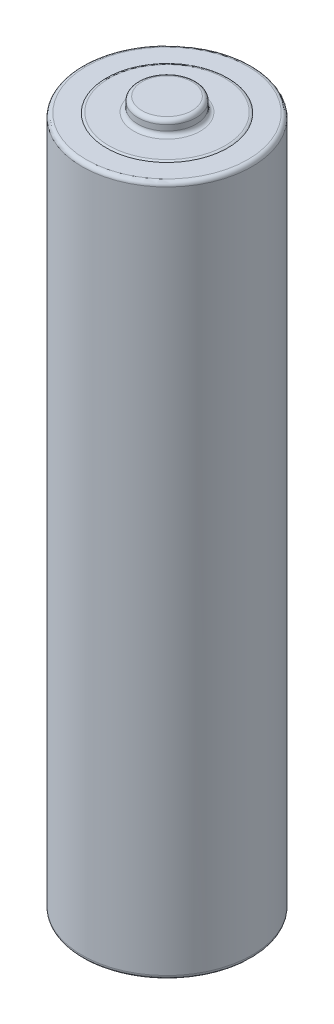
ISO-10303-21;
HEADER;
FILE_DESCRIPTION(('STEP AP214'),'2;1');
FILE_NAME('part.step','',(''),(''),'','','');
FILE_SCHEMA(('AUTOMOTIVE_DESIGN { 1 0 10303 214 1 1 1 1 }'));
ENDSEC;
DATA;
#1=APPLICATION_CONTEXT('core data for automotive mechanical design processes');
#2=APPLICATION_PROTOCOL_DEFINITION('international standard','automotive_design',2000,#1);
#3=PRODUCT_CONTEXT('',#1,'mechanical');
#4=PRODUCT('Part','Part','',(#3));
#5=PRODUCT_RELATED_PRODUCT_CATEGORY('part','',(#4));
#6=PRODUCT_DEFINITION_FORMATION('','',#4);
#7=PRODUCT_DEFINITION_CONTEXT('part definition',#1,'design');
#8=PRODUCT_DEFINITION('design','',#6,#7);
#9=PRODUCT_DEFINITION_SHAPE('','',#8);
#10=(LENGTH_UNIT() NAMED_UNIT(*) SI_UNIT(.MILLI.,.METRE.));
#11=(NAMED_UNIT(*) PLANE_ANGLE_UNIT() SI_UNIT($,.RADIAN.));
#12=(NAMED_UNIT(*) SI_UNIT($,.STERADIAN.) SOLID_ANGLE_UNIT());
#13=UNCERTAINTY_MEASURE_WITH_UNIT(LENGTH_MEASURE(1.E-05),#10,'distance_accuracy_value','');
#14=(GEOMETRIC_REPRESENTATION_CONTEXT(3) GLOBAL_UNCERTAINTY_ASSIGNED_CONTEXT((#13)) GLOBAL_UNIT_ASSIGNED_CONTEXT((#10,
#11,#12)) REPRESENTATION_CONTEXT('',''));
#15=CARTESIAN_POINT('',(0.,0.,0.));
#16=DIRECTION('',(0.,0.,1.));
#17=DIRECTION('',(1.,0.,0.));
#18=AXIS2_PLACEMENT_3D('',#15,#16,#17);
#19=CARTESIAN_POINT('',(1.8,22.2,0.));
#20=DIRECTION('',(0.,1.,0.));
#21=DIRECTION('',(0.,0.,1.));
#22=AXIS2_PLACEMENT_3D('',#19,#20,#21);
#23=PLANE('',#22);
#24=CARTESIAN_POINT('',(0.,22.2,0.));
#25=DIRECTION('',(0.,1.,0.));
#26=DIRECTION('',(0.,0.,1.));
#27=AXIS2_PLACEMENT_3D('',#24,#25,#26);
#28=CIRCLE('',#27,1.546);
#29=CARTESIAN_POINT('',(0.,22.2,1.546));
#30=VERTEX_POINT('',#29);
#31=EDGE_CURVE('E10',#30,#30,#28,.T.);
#32=ORIENTED_EDGE('',*,*,#31,.T.);
#33=EDGE_LOOP('',(#32));
#34=FACE_BOUND('',#33,.T.);
#35=ADVANCED_FACE('F33',(#34),#23,.T.);
#36=CARTESIAN_POINT('',(0.,-22.2,0.));
#37=DIRECTION('',(0.,-1.,0.));
#38=DIRECTION('',(0.,0.,-1.));
#39=AXIS2_PLACEMENT_3D('',#36,#37,#38);
#40=PLANE('',#39);
#41=CARTESIAN_POINT('',(0.,-22.2,0.));
#42=DIRECTION('',(0.,-1.,0.));
#43=DIRECTION('',(0.,0.,-1.));
#44=AXIS2_PLACEMENT_3D('',#41,#42,#43);
#45=CIRCLE('',#44,3.04600000000001);
#46=CARTESIAN_POINT('',(0.,-22.2,-3.04600000000001));
#47=VERTEX_POINT('',#46);
#48=EDGE_CURVE('E65',#47,#47,#45,.T.);
#49=ORIENTED_EDGE('',*,*,#48,.T.);
#50=EDGE_LOOP('',(#49));
#51=FACE_BOUND('',#50,.T.);
#52=ADVANCED_FACE('F102',(#51),#40,.T.);
#53=CARTESIAN_POINT('',(0.,-28.2802360600965,0.));
#54=DIRECTION('',(0.,-1.,0.));
#55=DIRECTION('',(0.,0.,-1.));
#56=AXIS2_PLACEMENT_3D('',#53,#54,#55);
#57=CYLINDRICAL_SURFACE('',#56,3.30000000000001);
#58=CARTESIAN_POINT('',(0.,-21.946,0.));
#59=DIRECTION('',(0.,-1.,0.));
#60=DIRECTION('',(0.,0.,-1.));
#61=AXIS2_PLACEMENT_3D('',#58,#59,#60);
#62=CIRCLE('',#61,3.30000000000001);
#63=CARTESIAN_POINT('',(0.,-21.946,-3.30000000000001));
#64=VERTEX_POINT('',#63);
#65=EDGE_CURVE('E59',#64,#64,#62,.F.);
#66=ORIENTED_EDGE('',*,*,#65,.T.);
#67=EDGE_LOOP('',(#66));
#68=FACE_BOUND('',#67,.T.);
#69=CARTESIAN_POINT('',(0.,-21.692,0.));
#70=DIRECTION('',(0.,-1.,0.));
#71=DIRECTION('',(0.,0.,-1.));
#72=AXIS2_PLACEMENT_3D('',#69,#70,#71);
#73=CIRCLE('',#72,3.30000000000001);
#74=CARTESIAN_POINT('',(0.,-21.692,-3.30000000000001));
#75=VERTEX_POINT('',#74);
#76=EDGE_CURVE('E62',#75,#75,#73,.T.);
#77=ORIENTED_EDGE('',*,*,#76,.T.);
#78=EDGE_LOOP('',(#77));
#79=FACE_BOUND('',#78,.T.);
#80=ADVANCED_FACE('F107',(#68,#79),#57,.T.);
#81=CARTESIAN_POINT('',(3.3,-21.438,0.));
#82=DIRECTION('',(0.,-1.,0.));
#83=DIRECTION('',(0.,0.,-1.));
#84=AXIS2_PLACEMENT_3D('',#81,#82,#83);
#85=PLANE('',#84);
#86=CARTESIAN_POINT('',(0.,-21.438,0.));
#87=DIRECTION('',(0.,-1.,0.));
#88=DIRECTION('',(0.,0.,-1.));
#89=AXIS2_PLACEMENT_3D('',#86,#87,#88);
#90=CIRCLE('',#89,3.55400000000001);
#91=CARTESIAN_POINT('',(0.,-21.438,-3.55400000000001));
#92=VERTEX_POINT('',#91);
#93=EDGE_CURVE('E56',#92,#92,#90,.F.);
#94=ORIENTED_EDGE('',*,*,#93,.T.);
#95=EDGE_LOOP('',(#94));
#96=FACE_BOUND('',#95,.T.);
#97=CARTESIAN_POINT('',(0.,-21.438,0.));
#98=DIRECTION('',(0.,-1.,0.));
#99=DIRECTION('',(0.,0.,-1.));
#100=AXIS2_PLACEMENT_3D('',#97,#98,#99);
#101=CIRCLE('',#100,4.99600000000001);
#102=CARTESIAN_POINT('',(0.,-21.438,-4.99600000000001));
#103=VERTEX_POINT('',#102);
#104=EDGE_CURVE('E68',#103,#103,#101,.T.);
#105=ORIENTED_EDGE('',*,*,#104,.T.);
#106=EDGE_LOOP('',(#105));
#107=FACE_BOUND('',#106,.T.);
#108=ADVANCED_FACE('F131',(#96,#107),#85,.T.);
#109=CARTESIAN_POINT('',(0.,-28.2802360600965,0.));
#110=DIRECTION('',(0.,-1.,0.));
#111=DIRECTION('',(0.,0.,-1.));
#112=AXIS2_PLACEMENT_3D('',#109,#110,#111);
#113=CYLINDRICAL_SURFACE('',#112,5.25000000000001);
#114=CARTESIAN_POINT('',(0.,21.046,0.));
#115=DIRECTION('',(0.,1.,0.));
#116=DIRECTION('',(0.,0.,1.));
#117=AXIS2_PLACEMENT_3D('',#114,#115,#116);
#118=CIRCLE('',#117,5.25000000000001);
#119=CARTESIAN_POINT('',(0.,21.046,5.25000000000001));
#120=VERTEX_POINT('',#119);
#121=EDGE_CURVE('E74',#120,#120,#118,.F.);
#122=ORIENTED_EDGE('',*,*,#121,.T.);
#123=EDGE_LOOP('',(#122));
#124=FACE_BOUND('',#123,.T.);
#125=CARTESIAN_POINT('',(0.,-21.184,0.));
#126=DIRECTION('',(0.,-1.,0.));
#127=DIRECTION('',(0.,0.,-1.));
#128=AXIS2_PLACEMENT_3D('',#125,#126,#127);
#129=CIRCLE('',#128,5.25000000000001);
#130=CARTESIAN_POINT('',(0.,-21.184,-5.25000000000001));
#131=VERTEX_POINT('',#130);
#132=EDGE_CURVE('E77',#131,#131,#129,.F.);
#133=ORIENTED_EDGE('',*,*,#132,.T.);
#134=EDGE_LOOP('',(#133));
#135=FACE_BOUND('',#134,.T.);
#136=ADVANCED_FACE('F137',(#124,#135),#113,.T.);
#137=CARTESIAN_POINT('',(5.25000000000001,21.3,0.));
#138=DIRECTION('',(0.,1.,0.));
#139=DIRECTION('',(0.,0.,1.));
#140=AXIS2_PLACEMENT_3D('',#137,#138,#139);
#141=PLANE('',#140);
#142=CARTESIAN_POINT('',(0.,21.3,0.));
#143=DIRECTION('',(0.,1.,0.));
#144=DIRECTION('',(0.,0.,1.));
#145=AXIS2_PLACEMENT_3D('',#142,#143,#144);
#146=CIRCLE('',#145,4.99600000000001);
#147=CARTESIAN_POINT('',(0.,21.3,4.99600000000001));
#148=VERTEX_POINT('',#147);
#149=EDGE_CURVE('E71',#148,#148,#146,.T.);
#150=ORIENTED_EDGE('',*,*,#149,.T.);
#151=EDGE_LOOP('',(#150));
#152=FACE_BOUND('',#151,.T.);
#153=CARTESIAN_POINT('',(0.,21.3,0.));
#154=DIRECTION('',(0.,-1.,0.));
#155=DIRECTION('',(0.,0.,-1.));
#156=AXIS2_PLACEMENT_3D('',#153,#154,#155);
#157=CIRCLE('',#156,3.75000000000001);
#158=CARTESIAN_POINT('',(0.,21.3,-3.75000000000001));
#159=VERTEX_POINT('',#158);
#160=EDGE_CURVE('E80',#159,#159,#157,.T.);
#161=ORIENTED_EDGE('',*,*,#160,.T.);
#162=EDGE_LOOP('',(#161));
#163=FACE_BOUND('',#162,.T.);
#164=ADVANCED_FACE('F84',(#152,#163),#141,.T.);
#165=CARTESIAN_POINT('',(3.75000000000001,21.35,0.));
#166=DIRECTION('',(0.,1.,0.));
#167=DIRECTION('',(0.,0.,1.));
#168=AXIS2_PLACEMENT_3D('',#165,#166,#167);
#169=PLANE('',#168);
#170=CARTESIAN_POINT('',(0.,21.35,0.));
#171=DIRECTION('',(0.,1.,0.));
#172=DIRECTION('',(0.,0.,1.));
#173=AXIS2_PLACEMENT_3D('',#170,#171,#172);
#174=CIRCLE('',#173,3.59867254049579);
#175=CARTESIAN_POINT('',(0.,21.35,3.59867254049579));
#176=VERTEX_POINT('',#175);
#177=EDGE_CURVE('E48',#176,#176,#174,.T.);
#178=ORIENTED_EDGE('',*,*,#177,.T.);
#179=EDGE_LOOP('',(#178));
#180=FACE_BOUND('',#179,.T.);
#181=CARTESIAN_POINT('',(0.,21.35,0.));
#182=DIRECTION('',(0.,1.,0.));
#183=DIRECTION('',(0.,0.,1.));
#184=AXIS2_PLACEMENT_3D('',#181,#182,#183);
#185=CIRCLE('',#184,2.054);
#186=CARTESIAN_POINT('',(0.,21.35,2.054));
#187=VERTEX_POINT('',#186);
#188=EDGE_CURVE('E53',#187,#187,#185,.F.);
#189=ORIENTED_EDGE('',*,*,#188,.T.);
#190=EDGE_LOOP('',(#189));
#191=FACE_BOUND('',#190,.T.);
#192=ADVANCED_FACE('F146',(#180,#191),#169,.T.);
#193=CARTESIAN_POINT('',(0.,-28.2802360600965,0.));
#194=DIRECTION('',(0.,-1.,0.));
#195=DIRECTION('',(0.,0.,-1.));
#196=AXIS2_PLACEMENT_3D('',#193,#194,#195);
#197=CYLINDRICAL_SURFACE('',#196,1.8);
#198=CARTESIAN_POINT('',(0.,21.604,0.));
#199=DIRECTION('',(0.,1.,0.));
#200=DIRECTION('',(0.,0.,1.));
#201=AXIS2_PLACEMENT_3D('',#198,#199,#200);
#202=CIRCLE('',#201,1.8);
#203=CARTESIAN_POINT('',(0.,21.604,1.8));
#204=VERTEX_POINT('',#203);
#205=EDGE_CURVE('E40',#204,#204,#202,.T.);
#206=ORIENTED_EDGE('',*,*,#205,.T.);
#207=EDGE_LOOP('',(#206));
#208=FACE_BOUND('',#207,.T.);
#209=CARTESIAN_POINT('',(0.,21.946,0.));
#210=DIRECTION('',(0.,1.,0.));
#211=DIRECTION('',(0.,0.,1.));
#212=AXIS2_PLACEMENT_3D('',#209,#210,#211);
#213=CIRCLE('',#212,1.8);
#214=CARTESIAN_POINT('',(0.,21.946,1.8));
#215=VERTEX_POINT('',#214);
#216=EDGE_CURVE('E44',#215,#215,#213,.F.);
#217=ORIENTED_EDGE('',*,*,#216,.T.);
#218=EDGE_LOOP('',(#217));
#219=FACE_BOUND('',#218,.T.);
#220=ADVANCED_FACE('F116',(#208,#219),#197,.T.);
#221=CARTESIAN_POINT('',(0.,21.046,0.));
#222=DIRECTION('',(0.,1.,0.));
#223=DIRECTION('',(0.,0.,1.));
#224=AXIS2_PLACEMENT_3D('',#221,#222,#223);
#225=TOROIDAL_SURFACE('',#224,4.99600000000001,0.254);
#226=ORIENTED_EDGE('',*,*,#149,.F.);
#227=EDGE_LOOP('',(#226));
#228=FACE_BOUND('',#227,.T.);
#229=ORIENTED_EDGE('',*,*,#121,.F.);
#230=EDGE_LOOP('',(#229));
#231=FACE_BOUND('',#230,.T.);
#232=ADVANCED_FACE('F112',(#228,#231),#225,.T.);
#233=CARTESIAN_POINT('',(0.,-21.184,0.));
#234=DIRECTION('',(0.,-1.,0.));
#235=DIRECTION('',(0.,0.,-1.));
#236=AXIS2_PLACEMENT_3D('',#233,#234,#235);
#237=TOROIDAL_SURFACE('',#236,4.99600000000001,0.254);
#238=ORIENTED_EDGE('',*,*,#132,.F.);
#239=EDGE_LOOP('',(#238));
#240=FACE_BOUND('',#239,.T.);
#241=ORIENTED_EDGE('',*,*,#104,.F.);
#242=EDGE_LOOP('',(#241));
#243=FACE_BOUND('',#242,.T.);
#244=ADVANCED_FACE('F115',(#240,#243),#237,.T.);
#245=CARTESIAN_POINT('',(0.,-21.946,0.));
#246=DIRECTION('',(0.,-1.,0.));
#247=DIRECTION('',(0.,0.,-1.));
#248=AXIS2_PLACEMENT_3D('',#245,#246,#247);
#249=TOROIDAL_SURFACE('',#248,3.04600000000001,0.254);
#250=ORIENTED_EDGE('',*,*,#65,.F.);
#251=EDGE_LOOP('',(#250));
#252=FACE_BOUND('',#251,.T.);
#253=ORIENTED_EDGE('',*,*,#48,.F.);
#254=EDGE_LOOP('',(#253));
#255=FACE_BOUND('',#254,.T.);
#256=ADVANCED_FACE('F97',(#252,#255),#249,.T.);
#257=CARTESIAN_POINT('',(0.,-21.692,0.));
#258=DIRECTION('',(0.,-1.,0.));
#259=DIRECTION('',(0.,0.,-1.));
#260=AXIS2_PLACEMENT_3D('',#257,#258,#259);
#261=TOROIDAL_SURFACE('',#260,3.55400000000001,0.254);
#262=ORIENTED_EDGE('',*,*,#93,.F.);
#263=EDGE_LOOP('',(#262));
#264=FACE_BOUND('',#263,.T.);
#265=ORIENTED_EDGE('',*,*,#76,.F.);
#266=EDGE_LOOP('',(#265));
#267=FACE_BOUND('',#266,.T.);
#268=ADVANCED_FACE('F89',(#264,#267),#261,.F.);
#269=CARTESIAN_POINT('',(0.,21.096,0.));
#270=DIRECTION('',(0.,-1.,0.));
#271=DIRECTION('',(0.,0.,-1.));
#272=AXIS2_PLACEMENT_3D('',#269,#270,#271);
#273=TOROIDAL_SURFACE('',#272,3.59867254049579,0.254);
#274=ORIENTED_EDGE('',*,*,#177,.F.);
#275=EDGE_LOOP('',(#274));
#276=FACE_BOUND('',#275,.T.);
#277=ORIENTED_EDGE('',*,*,#160,.F.);
#278=EDGE_LOOP('',(#277));
#279=FACE_BOUND('',#278,.T.);
#280=ADVANCED_FACE('F86',(#276,#279),#273,.T.);
#281=CARTESIAN_POINT('',(0.,21.604,0.));
#282=DIRECTION('',(0.,1.,0.));
#283=DIRECTION('',(0.,0.,1.));
#284=AXIS2_PLACEMENT_3D('',#281,#282,#283);
#285=TOROIDAL_SURFACE('',#284,2.054,0.254);
#286=ORIENTED_EDGE('',*,*,#205,.F.);
#287=EDGE_LOOP('',(#286));
#288=FACE_BOUND('',#287,.T.);
#289=ORIENTED_EDGE('',*,*,#188,.F.);
#290=EDGE_LOOP('',(#289));
#291=FACE_BOUND('',#290,.T.);
#292=ADVANCED_FACE('F88',(#288,#291),#285,.F.);
#293=CARTESIAN_POINT('',(0.,21.946,0.));
#294=DIRECTION('',(0.,1.,0.));
#295=DIRECTION('',(0.,0.,1.));
#296=AXIS2_PLACEMENT_3D('',#293,#294,#295);
#297=TOROIDAL_SURFACE('',#296,1.546,0.254);
#298=ORIENTED_EDGE('',*,*,#31,.F.);
#299=EDGE_LOOP('',(#298));
#300=FACE_BOUND('',#299,.T.);
#301=ORIENTED_EDGE('',*,*,#216,.F.);
#302=EDGE_LOOP('',(#301));
#303=FACE_BOUND('',#302,.T.);
#304=ADVANCED_FACE('F35',(#300,#303),#297,.T.);
#305=CLOSED_SHELL('',(#35,#52,#80,#108,#136,#164,#192,#220,#232,#244,#256,#268,#280,#292,#304));
#306=MANIFOLD_SOLID_BREP('B2',#305);
#307=ADVANCED_BREP_SHAPE_REPRESENTATION('',(#18,#306),#14);
#308=SHAPE_DEFINITION_REPRESENTATION(#9,#307);
ENDSEC;
END-ISO-10303-21;
